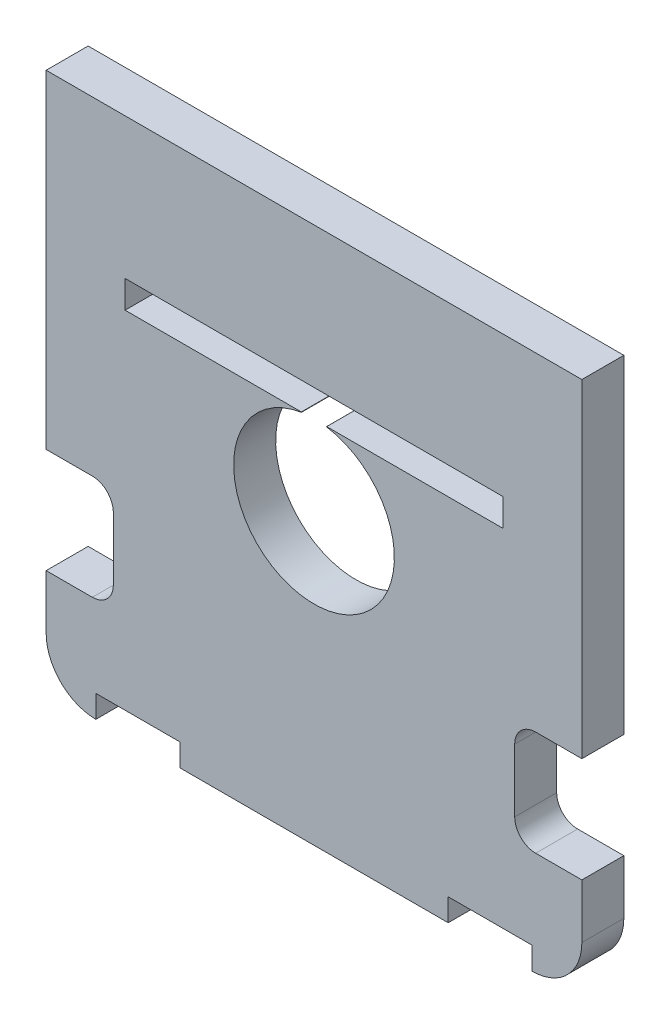
ISO-10303-21;
HEADER;
FILE_DESCRIPTION(('STEP AP214'),'2;1');
FILE_NAME('part.step','',(''),(''),'','','');
FILE_SCHEMA(('AUTOMOTIVE_DESIGN { 1 0 10303 214 1 1 1 1 }'));
ENDSEC;
DATA;
#1=APPLICATION_CONTEXT('core data for automotive mechanical design processes');
#2=APPLICATION_PROTOCOL_DEFINITION('international standard','automotive_design',2000,#1);
#3=PRODUCT_CONTEXT('',#1,'mechanical');
#4=PRODUCT('Part','Part','',(#3));
#5=PRODUCT_RELATED_PRODUCT_CATEGORY('part','',(#4));
#6=PRODUCT_DEFINITION_FORMATION('','',#4);
#7=PRODUCT_DEFINITION_CONTEXT('part definition',#1,'design');
#8=PRODUCT_DEFINITION('design','',#6,#7);
#9=PRODUCT_DEFINITION_SHAPE('','',#8);
#10=(LENGTH_UNIT() NAMED_UNIT(*) SI_UNIT(.MILLI.,.METRE.));
#11=(NAMED_UNIT(*) PLANE_ANGLE_UNIT() SI_UNIT($,.RADIAN.));
#12=(NAMED_UNIT(*) SI_UNIT($,.STERADIAN.) SOLID_ANGLE_UNIT());
#13=UNCERTAINTY_MEASURE_WITH_UNIT(LENGTH_MEASURE(1.E-05),#10,'distance_accuracy_value','');
#14=(GEOMETRIC_REPRESENTATION_CONTEXT(3) GLOBAL_UNCERTAINTY_ASSIGNED_CONTEXT((#13)) GLOBAL_UNIT_ASSIGNED_CONTEXT((#10,
#11,#12)) REPRESENTATION_CONTEXT('',''));
#15=CARTESIAN_POINT('',(0.,0.,0.));
#16=DIRECTION('',(0.,0.,1.));
#17=DIRECTION('',(1.,0.,0.));
#18=AXIS2_PLACEMENT_3D('',#15,#16,#17);
#19=CARTESIAN_POINT('',(8814.23882325293,3005.60430587339,6.35));
#20=DIRECTION('',(0.,0.,1.));
#21=DIRECTION('',(1.,0.,0.));
#22=AXIS2_PLACEMENT_3D('',#19,#20,#21);
#23=PLANE('',#22);
#24=DIRECTION('',(-1.,0.,0.));
#25=VECTOR('',#24,1.);
#26=CARTESIAN_POINT('',(8740.19782325293,3058.44597791145,6.35));
#27=LINE('',#26,#25);
#28=CARTESIAN_POINT('',(8821.22382325293,3058.44597791145,6.35));
#29=VERTEX_POINT('',#28);
#30=CARTESIAN_POINT('',(8740.19782325293,3058.44597791145,6.35));
#31=VERTEX_POINT('',#30);
#32=EDGE_CURVE('E311',#29,#31,#27,.T.);
#33=ORIENTED_EDGE('',*,*,#32,.T.);
#34=DIRECTION('',(0.,-1.,0.));
#35=VECTOR('',#34,1.);
#36=CARTESIAN_POINT('',(8740.19782325293,3008.77930587339,6.35));
#37=LINE('',#36,#35);
#38=CARTESIAN_POINT('',(8740.19782325293,3008.77930587339,6.35));
#39=VERTEX_POINT('',#38);
#40=EDGE_CURVE('E314',#31,#39,#37,.T.);
#41=ORIENTED_EDGE('',*,*,#40,.T.);
#42=DIRECTION('',(1.,0.,0.));
#43=VECTOR('',#42,1.);
#44=CARTESIAN_POINT('',(8740.19782325293,3008.77930587339,6.35));
#45=LINE('',#44,#43);
#46=CARTESIAN_POINT('',(8747.18282325293,3008.77930587339,6.35));
#47=VERTEX_POINT('',#46);
#48=EDGE_CURVE('E317',#39,#47,#45,.T.);
#49=ORIENTED_EDGE('',*,*,#48,.T.);
#50=CARTESIAN_POINT('',(8747.18282325293,3005.60430587339,6.35));
#51=DIRECTION('',(0.,0.,-1.));
#52=DIRECTION('',(1.,0.,0.));
#53=AXIS2_PLACEMENT_3D('',#50,#51,#52);
#54=CIRCLE('',#53,3.17500000000037);
#55=CARTESIAN_POINT('',(8750.35782325293,3005.60430587339,6.35));
#56=VERTEX_POINT('',#55);
#57=EDGE_CURVE('E319',#47,#56,#54,.T.);
#58=ORIENTED_EDGE('',*,*,#57,.T.);
#59=DIRECTION('',(0.,-1.,0.));
#60=VECTOR('',#59,1.);
#61=CARTESIAN_POINT('',(8750.35782325293,3005.60430587339,6.35));
#62=LINE('',#61,#60);
#63=CARTESIAN_POINT('',(8750.35782325293,2996.07930587339,6.35));
#64=VERTEX_POINT('',#63);
#65=EDGE_CURVE('E321',#56,#64,#62,.T.);
#66=ORIENTED_EDGE('',*,*,#65,.T.);
#67=CARTESIAN_POINT('',(8747.18282325293,2996.07930587339,6.35));
#68=DIRECTION('',(0.,0.,-1.));
#69=DIRECTION('',(1.,0.,0.));
#70=AXIS2_PLACEMENT_3D('',#67,#68,#69);
#71=CIRCLE('',#70,3.17500000000037);
#72=CARTESIAN_POINT('',(8747.18282325293,2992.90430587339,6.35));
#73=VERTEX_POINT('',#72);
#74=EDGE_CURVE('E323',#64,#73,#71,.T.);
#75=ORIENTED_EDGE('',*,*,#74,.T.);
#76=DIRECTION('',(-1.,0.,0.));
#77=VECTOR('',#76,1.);
#78=CARTESIAN_POINT('',(8740.19782325293,2992.90430587339,6.35));
#79=LINE('',#78,#77);
#80=CARTESIAN_POINT('',(8740.19782325293,2992.90430587339,6.35));
#81=VERTEX_POINT('',#80);
#82=EDGE_CURVE('E325',#73,#81,#79,.T.);
#83=ORIENTED_EDGE('',*,*,#82,.T.);
#84=DIRECTION('',(2.16517983398784E-13,-1.,0.));
#85=VECTOR('',#84,1.);
#86=CARTESIAN_POINT('',(8740.19782325293,2984.70010587339,6.35));
#87=LINE('',#86,#85);
#88=CARTESIAN_POINT('',(8740.19782325293,2984.70010587339,6.35));
#89=VERTEX_POINT('',#88);
#90=EDGE_CURVE('E327',#81,#89,#87,.T.);
#91=ORIENTED_EDGE('',*,*,#90,.T.);
#92=CARTESIAN_POINT('',(8747.71622325293,2984.70010587339,6.35));
#93=DIRECTION('',(0.,0.,1.));
#94=DIRECTION('',(1.,0.,0.));
#95=AXIS2_PLACEMENT_3D('',#92,#93,#94);
#96=CIRCLE('',#95,7.51839999999904);
#97=CARTESIAN_POINT('',(8747.71622325293,2977.18170587339,6.35));
#98=VERTEX_POINT('',#97);
#99=EDGE_CURVE('E329',#89,#98,#96,.T.);
#100=ORIENTED_EDGE('',*,*,#99,.T.);
#101=DIRECTION('',(0.,1.,0.));
#102=VECTOR('',#101,1.);
#103=CARTESIAN_POINT('',(8747.71622325293,2980.58530587339,6.35));
#104=LINE('',#103,#102);
#105=CARTESIAN_POINT('',(8747.71622325293,2980.58530587339,6.35));
#106=VERTEX_POINT('',#105);
#107=EDGE_CURVE('E331',#98,#106,#104,.T.);
#108=ORIENTED_EDGE('',*,*,#107,.T.);
#109=DIRECTION('',(1.,0.,0.));
#110=VECTOR('',#109,1.);
#111=CARTESIAN_POINT('',(8760.41622325293,2980.58530587339,6.35));
#112=LINE('',#111,#110);
#113=CARTESIAN_POINT('',(8760.41622325293,2980.58530587339,6.35));
#114=VERTEX_POINT('',#113);
#115=EDGE_CURVE('E333',#106,#114,#112,.T.);
#116=ORIENTED_EDGE('',*,*,#115,.T.);
#117=DIRECTION('',(-1.04381057668354E-12,-1.,0.));
#118=VECTOR('',#117,1.);
#119=CARTESIAN_POINT('',(8760.41622325293,2980.58530587339,6.35));
#120=LINE('',#119,#118);
#121=CARTESIAN_POINT('',(8760.41622325293,2977.18170587339,6.35));
#122=VERTEX_POINT('',#121);
#123=EDGE_CURVE('E335',#114,#122,#120,.T.);
#124=ORIENTED_EDGE('',*,*,#123,.T.);
#125=DIRECTION('',(1.,0.,0.));
#126=VECTOR('',#125,1.);
#127=CARTESIAN_POINT('',(8801.00542325293,2977.18170587339,6.35));
#128=LINE('',#127,#126);
#129=CARTESIAN_POINT('',(8801.00542325293,2977.18170587339,6.35));
#130=VERTEX_POINT('',#129);
#131=EDGE_CURVE('E337',#122,#130,#128,.T.);
#132=ORIENTED_EDGE('',*,*,#131,.T.);
#133=DIRECTION('',(0.,1.,0.));
#134=VECTOR('',#133,1.);
#135=CARTESIAN_POINT('',(8801.00542325293,2980.58530587339,6.35));
#136=LINE('',#135,#134);
#137=CARTESIAN_POINT('',(8801.00542325293,2980.58530587339,6.35));
#138=VERTEX_POINT('',#137);
#139=EDGE_CURVE('E339',#130,#138,#136,.T.);
#140=ORIENTED_EDGE('',*,*,#139,.T.);
#141=DIRECTION('',(1.,0.,0.));
#142=VECTOR('',#141,1.);
#143=CARTESIAN_POINT('',(8813.70542325293,2980.58530587339,6.35));
#144=LINE('',#143,#142);
#145=CARTESIAN_POINT('',(8813.70542325293,2980.58530587339,6.35));
#146=VERTEX_POINT('',#145);
#147=EDGE_CURVE('E341',#138,#146,#144,.T.);
#148=ORIENTED_EDGE('',*,*,#147,.T.);
#149=DIRECTION('',(0.,-1.,0.));
#150=VECTOR('',#149,1.);
#151=CARTESIAN_POINT('',(8813.70542325293,2980.58530587339,6.35));
#152=LINE('',#151,#150);
#153=CARTESIAN_POINT('',(8813.70542325293,2977.18170587339,6.35));
#154=VERTEX_POINT('',#153);
#155=EDGE_CURVE('E343',#146,#154,#152,.T.);
#156=ORIENTED_EDGE('',*,*,#155,.T.);
#157=CARTESIAN_POINT('',(8813.70542325293,2984.70010587339,6.35));
#158=DIRECTION('',(0.,0.,1.));
#159=DIRECTION('',(1.,0.,0.));
#160=AXIS2_PLACEMENT_3D('',#157,#158,#159);
#161=CIRCLE('',#160,7.51840000000015);
#162=CARTESIAN_POINT('',(8821.22382325293,2984.70010587339,6.35));
#163=VERTEX_POINT('',#162);
#164=EDGE_CURVE('E345',#154,#163,#161,.T.);
#165=ORIENTED_EDGE('',*,*,#164,.T.);
#166=DIRECTION('',(2.16517983398784E-13,1.,0.));
#167=VECTOR('',#166,1.);
#168=CARTESIAN_POINT('',(8821.22382325293,2992.90430587339,6.35));
#169=LINE('',#168,#167);
#170=CARTESIAN_POINT('',(8821.22382325293,2992.90430587339,6.35));
#171=VERTEX_POINT('',#170);
#172=EDGE_CURVE('E347',#163,#171,#169,.T.);
#173=ORIENTED_EDGE('',*,*,#172,.T.);
#174=DIRECTION('',(-1.,0.,0.));
#175=VECTOR('',#174,1.);
#176=CARTESIAN_POINT('',(8821.22382325293,2992.90430587339,6.35));
#177=LINE('',#176,#175);
#178=CARTESIAN_POINT('',(8814.23882325293,2992.90430587339,6.35));
#179=VERTEX_POINT('',#178);
#180=EDGE_CURVE('E349',#171,#179,#177,.T.);
#181=ORIENTED_EDGE('',*,*,#180,.T.);
#182=CARTESIAN_POINT('',(8814.23882325293,2996.07930587339,6.35));
#183=DIRECTION('',(0.,0.,-1.));
#184=DIRECTION('',(1.,0.,0.));
#185=AXIS2_PLACEMENT_3D('',#182,#183,#184);
#186=CIRCLE('',#185,3.17500000000037);
#187=CARTESIAN_POINT('',(8811.06382325293,2996.07930587339,6.35));
#188=VERTEX_POINT('',#187);
#189=EDGE_CURVE('E351',#179,#188,#186,.T.);
#190=ORIENTED_EDGE('',*,*,#189,.T.);
#191=DIRECTION('',(0.,1.,0.));
#192=VECTOR('',#191,1.);
#193=CARTESIAN_POINT('',(8811.06382325293,3005.60430587339,6.35));
#194=LINE('',#193,#192);
#195=CARTESIAN_POINT('',(8811.06382325293,3005.60430587339,6.35));
#196=VERTEX_POINT('',#195);
#197=EDGE_CURVE('E353',#188,#196,#194,.T.);
#198=ORIENTED_EDGE('',*,*,#197,.T.);
#199=CARTESIAN_POINT('',(8814.23882325293,3005.60430587339,6.35));
#200=DIRECTION('',(0.,0.,-1.));
#201=DIRECTION('',(1.,0.,0.));
#202=AXIS2_PLACEMENT_3D('',#199,#200,#201);
#203=CIRCLE('',#202,3.17500000000037);
#204=CARTESIAN_POINT('',(8814.23882325293,3008.77930587339,6.35));
#205=VERTEX_POINT('',#204);
#206=EDGE_CURVE('E355',#196,#205,#203,.T.);
#207=ORIENTED_EDGE('',*,*,#206,.T.);
#208=DIRECTION('',(1.,0.,0.));
#209=VECTOR('',#208,1.);
#210=CARTESIAN_POINT('',(8821.22382325293,3008.77930587339,6.35));
#211=LINE('',#210,#209);
#212=CARTESIAN_POINT('',(8821.22382325293,3008.77930587339,6.35));
#213=VERTEX_POINT('',#212);
#214=EDGE_CURVE('E357',#205,#213,#211,.T.);
#215=ORIENTED_EDGE('',*,*,#214,.T.);
#216=DIRECTION('',(0.,1.,0.));
#217=VECTOR('',#216,1.);
#218=CARTESIAN_POINT('',(8821.22382325293,3058.44597791145,6.35));
#219=LINE('',#218,#217);
#220=EDGE_CURVE('E359',#213,#29,#219,.T.);
#221=ORIENTED_EDGE('',*,*,#220,.T.);
#222=EDGE_LOOP('',(#33,#41,#49,#58,#66,#75,#83,#91,#100,#108,#116,#124,#132,#140,#148,#156,#165,
#173,#181,#190,#198,#207,#215,#221));
#223=FACE_BOUND('',#222,.T.);
#224=DIRECTION('',(0.,-1.,0.));
#225=VECTOR('',#224,1.);
#226=CARTESIAN_POINT('',(8752.13582325293,3032.98550587339,6.35));
#227=LINE('',#226,#225);
#228=CARTESIAN_POINT('',(8752.13582325293,3037.15110587339,6.35));
#229=VERTEX_POINT('',#228);
#230=CARTESIAN_POINT('',(8752.13582325293,3032.98550587339,6.35));
#231=VERTEX_POINT('',#230);
#232=EDGE_CURVE('E254',#229,#231,#227,.T.);
#233=ORIENTED_EDGE('',*,*,#232,.F.);
#234=DIRECTION('',(-1.,0.,0.));
#235=VECTOR('',#234,1.);
#236=CARTESIAN_POINT('',(8752.13582325293,3037.15110587339,6.35));
#237=LINE('',#236,#235);
#238=CARTESIAN_POINT('',(8809.28582325293,3037.15110587339,6.35));
#239=VERTEX_POINT('',#238);
#240=EDGE_CURVE('E246',#239,#229,#237,.T.);
#241=ORIENTED_EDGE('',*,*,#240,.F.);
#242=DIRECTION('',(4.26434808767026E-13,1.,0.));
#243=VECTOR('',#242,1.);
#244=CARTESIAN_POINT('',(8809.28582325293,3037.15110587339,6.35));
#245=LINE('',#244,#243);
#246=CARTESIAN_POINT('',(8809.28582325293,3032.98550587339,6.35));
#247=VERTEX_POINT('',#246);
#248=EDGE_CURVE('E279',#247,#239,#245,.T.);
#249=ORIENTED_EDGE('',*,*,#248,.F.);
#250=DIRECTION('',(1.,0.,0.));
#251=VECTOR('',#250,1.);
#252=CARTESIAN_POINT('',(8809.28582325293,3032.98550587339,6.35));
#253=LINE('',#252,#251);
#254=CARTESIAN_POINT('',(8782.63150669621,3032.98550587339,6.35));
#255=VERTEX_POINT('',#254);
#256=EDGE_CURVE('E277',#255,#247,#253,.T.);
#257=ORIENTED_EDGE('',*,*,#256,.F.);
#258=CARTESIAN_POINT('',(8782.63150669622,3032.96010587339,6.35));
#259=DIRECTION('',(0.,0.,-1.));
#260=DIRECTION('',(1.,0.,0.));
#261=AXIS2_PLACEMENT_3D('',#258,#259,#260);
#262=CIRCLE('',#261,0.025400000191103);
#263=CARTESIAN_POINT('',(8782.62750109985,3032.93502370428,6.35));
#264=VERTEX_POINT('',#263);
#265=EDGE_CURVE('E275',#264,#255,#262,.T.);
#266=ORIENTED_EDGE('',*,*,#265,.F.);
#267=CARTESIAN_POINT('',(8780.71082325293,3020.93320587339,6.35));
#268=DIRECTION('',(0.,0.,1.));
#269=DIRECTION('',(1.,0.,0.));
#270=AXIS2_PLACEMENT_3D('',#267,#268,#269);
#271=CIRCLE('',#270,12.1538999999998);
#272=CARTESIAN_POINT('',(8778.79414540604,3032.93502370409,6.35));
#273=VERTEX_POINT('',#272);
#274=EDGE_CURVE('E273',#273,#264,#271,.T.);
#275=ORIENTED_EDGE('',*,*,#274,.F.);
#276=CARTESIAN_POINT('',(8778.79013981207,3032.96010587339,6.35));
#277=DIRECTION('',(0.,0.,-1.));
#278=DIRECTION('',(1.,0.,0.));
#279=AXIS2_PLACEMENT_3D('',#276,#277,#278);
#280=CIRCLE('',#279,0.0254000000000682);
#281=CARTESIAN_POINT('',(8778.79013980965,3032.98550587339,6.35));
#282=VERTEX_POINT('',#281);
#283=EDGE_CURVE('E269',#282,#273,#280,.T.);
#284=ORIENTED_EDGE('',*,*,#283,.F.);
#285=DIRECTION('',(1.,0.,0.));
#286=VECTOR('',#285,1.);
#287=CARTESIAN_POINT('',(8778.79013980965,3032.98550587339,6.35));
#288=LINE('',#287,#286);
#289=EDGE_CURVE('E267',#231,#282,#288,.T.);
#290=ORIENTED_EDGE('',*,*,#289,.F.);
#291=EDGE_LOOP('',(#233,#241,#249,#257,#266,#275,#284,#290));
#292=FACE_BOUND('',#291,.T.);
#293=ADVANCED_FACE('F37',(#223,#292),#23,.T.);
#294=CARTESIAN_POINT('',(8814.23882325293,3005.60430587339,0.));
#295=DIRECTION('',(0.,0.,1.));
#296=DIRECTION('',(1.,0.,0.));
#297=AXIS2_PLACEMENT_3D('',#294,#295,#296);
#298=PLANE('',#297);
#299=DIRECTION('',(-1.,0.,0.));
#300=VECTOR('',#299,1.);
#301=CARTESIAN_POINT('',(8740.19782325293,3058.44597791145,0.));
#302=LINE('',#301,#300);
#303=CARTESIAN_POINT('',(8821.22382325293,3058.44597791145,0.));
#304=VERTEX_POINT('',#303);
#305=CARTESIAN_POINT('',(8740.19782325293,3058.44597791145,0.));
#306=VERTEX_POINT('',#305);
#307=EDGE_CURVE('E262',#304,#306,#302,.T.);
#308=ORIENTED_EDGE('',*,*,#307,.F.);
#309=DIRECTION('',(0.,1.,0.));
#310=VECTOR('',#309,1.);
#311=CARTESIAN_POINT('',(8821.22382325293,3058.44597791145,0.));
#312=LINE('',#311,#310);
#313=CARTESIAN_POINT('',(8821.22382325293,3008.77930587339,0.));
#314=VERTEX_POINT('',#313);
#315=EDGE_CURVE('E315',#314,#304,#312,.T.);
#316=ORIENTED_EDGE('',*,*,#315,.F.);
#317=DIRECTION('',(1.,0.,0.));
#318=VECTOR('',#317,1.);
#319=CARTESIAN_POINT('',(8821.22382325293,3008.77930587339,0.));
#320=LINE('',#319,#318);
#321=CARTESIAN_POINT('',(8814.23882325293,3008.77930587339,0.));
#322=VERTEX_POINT('',#321);
#323=EDGE_CURVE('E406',#322,#314,#320,.T.);
#324=ORIENTED_EDGE('',*,*,#323,.F.);
#325=CARTESIAN_POINT('',(8814.23882325293,3005.60430587339,0.));
#326=DIRECTION('',(0.,0.,-1.));
#327=DIRECTION('',(1.,0.,0.));
#328=AXIS2_PLACEMENT_3D('',#325,#326,#327);
#329=CIRCLE('',#328,3.17500000000037);
#330=CARTESIAN_POINT('',(8811.06382325293,3005.60430587339,0.));
#331=VERTEX_POINT('',#330);
#332=EDGE_CURVE('E404',#331,#322,#329,.T.);
#333=ORIENTED_EDGE('',*,*,#332,.F.);
#334=DIRECTION('',(0.,1.,0.));
#335=VECTOR('',#334,1.);
#336=CARTESIAN_POINT('',(8811.06382325293,3005.60430587339,0.));
#337=LINE('',#336,#335);
#338=CARTESIAN_POINT('',(8811.06382325293,2996.07930587339,0.));
#339=VERTEX_POINT('',#338);
#340=EDGE_CURVE('E402',#339,#331,#337,.T.);
#341=ORIENTED_EDGE('',*,*,#340,.F.);
#342=CARTESIAN_POINT('',(8814.23882325293,2996.07930587339,0.));
#343=DIRECTION('',(0.,0.,-1.));
#344=DIRECTION('',(1.,0.,0.));
#345=AXIS2_PLACEMENT_3D('',#342,#343,#344);
#346=CIRCLE('',#345,3.17500000000037);
#347=CARTESIAN_POINT('',(8814.23882325293,2992.90430587339,0.));
#348=VERTEX_POINT('',#347);
#349=EDGE_CURVE('E400',#348,#339,#346,.T.);
#350=ORIENTED_EDGE('',*,*,#349,.F.);
#351=DIRECTION('',(-1.,0.,0.));
#352=VECTOR('',#351,1.);
#353=CARTESIAN_POINT('',(8821.22382325293,2992.90430587339,0.));
#354=LINE('',#353,#352);
#355=CARTESIAN_POINT('',(8821.22382325293,2992.90430587339,0.));
#356=VERTEX_POINT('',#355);
#357=EDGE_CURVE('E398',#356,#348,#354,.T.);
#358=ORIENTED_EDGE('',*,*,#357,.F.);
#359=DIRECTION('',(2.16517983398784E-13,1.,0.));
#360=VECTOR('',#359,1.);
#361=CARTESIAN_POINT('',(8821.22382325293,2992.90430587339,0.));
#362=LINE('',#361,#360);
#363=CARTESIAN_POINT('',(8821.22382325293,2984.70010587339,0.));
#364=VERTEX_POINT('',#363);
#365=EDGE_CURVE('E396',#364,#356,#362,.T.);
#366=ORIENTED_EDGE('',*,*,#365,.F.);
#367=CARTESIAN_POINT('',(8813.70542325293,2984.70010587339,0.));
#368=DIRECTION('',(0.,0.,1.));
#369=DIRECTION('',(1.,0.,0.));
#370=AXIS2_PLACEMENT_3D('',#367,#368,#369);
#371=CIRCLE('',#370,7.51840000000015);
#372=CARTESIAN_POINT('',(8813.70542325293,2977.18170587339,0.));
#373=VERTEX_POINT('',#372);
#374=EDGE_CURVE('E394',#373,#364,#371,.T.);
#375=ORIENTED_EDGE('',*,*,#374,.F.);
#376=DIRECTION('',(0.,-1.,0.));
#377=VECTOR('',#376,1.);
#378=CARTESIAN_POINT('',(8813.70542325293,2980.58530587339,0.));
#379=LINE('',#378,#377);
#380=CARTESIAN_POINT('',(8813.70542325293,2980.58530587339,0.));
#381=VERTEX_POINT('',#380);
#382=EDGE_CURVE('E392',#381,#373,#379,.T.);
#383=ORIENTED_EDGE('',*,*,#382,.F.);
#384=DIRECTION('',(1.,0.,0.));
#385=VECTOR('',#384,1.);
#386=CARTESIAN_POINT('',(8813.70542325293,2980.58530587339,0.));
#387=LINE('',#386,#385);
#388=CARTESIAN_POINT('',(8801.00542325293,2980.58530587339,0.));
#389=VERTEX_POINT('',#388);
#390=EDGE_CURVE('E390',#389,#381,#387,.T.);
#391=ORIENTED_EDGE('',*,*,#390,.F.);
#392=DIRECTION('',(0.,1.,0.));
#393=VECTOR('',#392,1.);
#394=CARTESIAN_POINT('',(8801.00542325293,2980.58530587339,0.));
#395=LINE('',#394,#393);
#396=CARTESIAN_POINT('',(8801.00542325293,2977.18170587339,0.));
#397=VERTEX_POINT('',#396);
#398=EDGE_CURVE('E388',#397,#389,#395,.T.);
#399=ORIENTED_EDGE('',*,*,#398,.F.);
#400=DIRECTION('',(1.,0.,0.));
#401=VECTOR('',#400,1.);
#402=CARTESIAN_POINT('',(8801.00542325293,2977.18170587339,0.));
#403=LINE('',#402,#401);
#404=CARTESIAN_POINT('',(8760.41622325293,2977.18170587339,0.));
#405=VERTEX_POINT('',#404);
#406=EDGE_CURVE('E386',#405,#397,#403,.T.);
#407=ORIENTED_EDGE('',*,*,#406,.F.);
#408=DIRECTION('',(-1.04381057668354E-12,-1.,0.));
#409=VECTOR('',#408,1.);
#410=CARTESIAN_POINT('',(8760.41622325293,2980.58530587339,0.));
#411=LINE('',#410,#409);
#412=CARTESIAN_POINT('',(8760.41622325293,2980.58530587339,0.));
#413=VERTEX_POINT('',#412);
#414=EDGE_CURVE('E384',#413,#405,#411,.T.);
#415=ORIENTED_EDGE('',*,*,#414,.F.);
#416=DIRECTION('',(1.,0.,0.));
#417=VECTOR('',#416,1.);
#418=CARTESIAN_POINT('',(8760.41622325293,2980.58530587339,0.));
#419=LINE('',#418,#417);
#420=CARTESIAN_POINT('',(8747.71622325293,2980.58530587339,0.));
#421=VERTEX_POINT('',#420);
#422=EDGE_CURVE('E382',#421,#413,#419,.T.);
#423=ORIENTED_EDGE('',*,*,#422,.F.);
#424=DIRECTION('',(0.,1.,0.));
#425=VECTOR('',#424,1.);
#426=CARTESIAN_POINT('',(8747.71622325293,2980.58530587339,0.));
#427=LINE('',#426,#425);
#428=CARTESIAN_POINT('',(8747.71622325293,2977.18170587339,0.));
#429=VERTEX_POINT('',#428);
#430=EDGE_CURVE('E380',#429,#421,#427,.T.);
#431=ORIENTED_EDGE('',*,*,#430,.F.);
#432=CARTESIAN_POINT('',(8747.71622325293,2984.70010587339,0.));
#433=DIRECTION('',(0.,0.,1.));
#434=DIRECTION('',(1.,0.,0.));
#435=AXIS2_PLACEMENT_3D('',#432,#433,#434);
#436=CIRCLE('',#435,7.51839999999904);
#437=CARTESIAN_POINT('',(8740.19782325293,2984.70010587339,0.));
#438=VERTEX_POINT('',#437);
#439=EDGE_CURVE('E378',#438,#429,#436,.T.);
#440=ORIENTED_EDGE('',*,*,#439,.F.);
#441=DIRECTION('',(2.16517983398784E-13,-1.,0.));
#442=VECTOR('',#441,1.);
#443=CARTESIAN_POINT('',(8740.19782325293,2984.70010587339,0.));
#444=LINE('',#443,#442);
#445=CARTESIAN_POINT('',(8740.19782325293,2992.90430587339,0.));
#446=VERTEX_POINT('',#445);
#447=EDGE_CURVE('E376',#446,#438,#444,.T.);
#448=ORIENTED_EDGE('',*,*,#447,.F.);
#449=DIRECTION('',(-1.,0.,0.));
#450=VECTOR('',#449,1.);
#451=CARTESIAN_POINT('',(8740.19782325293,2992.90430587339,0.));
#452=LINE('',#451,#450);
#453=CARTESIAN_POINT('',(8747.18282325293,2992.90430587339,0.));
#454=VERTEX_POINT('',#453);
#455=EDGE_CURVE('E374',#454,#446,#452,.T.);
#456=ORIENTED_EDGE('',*,*,#455,.F.);
#457=CARTESIAN_POINT('',(8747.18282325293,2996.07930587339,0.));
#458=DIRECTION('',(0.,0.,-1.));
#459=DIRECTION('',(1.,0.,0.));
#460=AXIS2_PLACEMENT_3D('',#457,#458,#459);
#461=CIRCLE('',#460,3.17500000000037);
#462=CARTESIAN_POINT('',(8750.35782325293,2996.07930587339,0.));
#463=VERTEX_POINT('',#462);
#464=EDGE_CURVE('E372',#463,#454,#461,.T.);
#465=ORIENTED_EDGE('',*,*,#464,.F.);
#466=DIRECTION('',(0.,-1.,0.));
#467=VECTOR('',#466,1.);
#468=CARTESIAN_POINT('',(8750.35782325293,3005.60430587339,0.));
#469=LINE('',#468,#467);
#470=CARTESIAN_POINT('',(8750.35782325293,3005.60430587339,0.));
#471=VERTEX_POINT('',#470);
#472=EDGE_CURVE('E370',#471,#463,#469,.T.);
#473=ORIENTED_EDGE('',*,*,#472,.F.);
#474=CARTESIAN_POINT('',(8747.18282325293,3005.60430587339,0.));
#475=DIRECTION('',(0.,0.,-1.));
#476=DIRECTION('',(1.,0.,0.));
#477=AXIS2_PLACEMENT_3D('',#474,#475,#476);
#478=CIRCLE('',#477,3.17500000000037);
#479=CARTESIAN_POINT('',(8747.18282325293,3008.77930587339,0.));
#480=VERTEX_POINT('',#479);
#481=EDGE_CURVE('E368',#480,#471,#478,.T.);
#482=ORIENTED_EDGE('',*,*,#481,.F.);
#483=DIRECTION('',(1.,0.,0.));
#484=VECTOR('',#483,1.);
#485=CARTESIAN_POINT('',(8740.19782325293,3008.77930587339,0.));
#486=LINE('',#485,#484);
#487=CARTESIAN_POINT('',(8740.19782325293,3008.77930587339,0.));
#488=VERTEX_POINT('',#487);
#489=EDGE_CURVE('E366',#488,#480,#486,.T.);
#490=ORIENTED_EDGE('',*,*,#489,.F.);
#491=DIRECTION('',(0.,-1.,0.));
#492=VECTOR('',#491,1.);
#493=CARTESIAN_POINT('',(8740.19782325293,3008.77930587339,0.));
#494=LINE('',#493,#492);
#495=EDGE_CURVE('E364',#306,#488,#494,.T.);
#496=ORIENTED_EDGE('',*,*,#495,.F.);
#497=EDGE_LOOP('',(#308,#316,#324,#333,#341,#350,#358,#366,#375,#383,#391,#399,#407,#415,#423,
#431,#440,#448,#456,#465,#473,#482,#490,#496));
#498=FACE_BOUND('',#497,.T.);
#499=DIRECTION('',(-1.,0.,0.));
#500=VECTOR('',#499,1.);
#501=CARTESIAN_POINT('',(8752.13582325293,3037.15110587339,0.));
#502=LINE('',#501,#500);
#503=CARTESIAN_POINT('',(8809.28582325293,3037.15110587339,0.));
#504=VERTEX_POINT('',#503);
#505=CARTESIAN_POINT('',(8752.13582325293,3037.15110587339,0.));
#506=VERTEX_POINT('',#505);
#507=EDGE_CURVE('E60',#504,#506,#502,.T.);
#508=ORIENTED_EDGE('',*,*,#507,.T.);
#509=DIRECTION('',(0.,-1.,0.));
#510=VECTOR('',#509,1.);
#511=CARTESIAN_POINT('',(8752.13582325293,3032.98550587339,0.));
#512=LINE('',#511,#510);
#513=CARTESIAN_POINT('',(8752.13582325293,3032.98550587339,0.));
#514=VERTEX_POINT('',#513);
#515=EDGE_CURVE('E261',#506,#514,#512,.T.);
#516=ORIENTED_EDGE('',*,*,#515,.T.);
#517=DIRECTION('',(1.,0.,0.));
#518=VECTOR('',#517,1.);
#519=CARTESIAN_POINT('',(8778.79013980965,3032.98550587339,0.));
#520=LINE('',#519,#518);
#521=CARTESIAN_POINT('',(8778.79013980965,3032.98550587339,0.));
#522=VERTEX_POINT('',#521);
#523=EDGE_CURVE('E283',#514,#522,#520,.T.);
#524=ORIENTED_EDGE('',*,*,#523,.T.);
#525=CARTESIAN_POINT('',(8778.79013981207,3032.96010587339,0.));
#526=DIRECTION('',(0.,0.,-1.));
#527=DIRECTION('',(1.,0.,0.));
#528=AXIS2_PLACEMENT_3D('',#525,#526,#527);
#529=CIRCLE('',#528,0.0254000000000682);
#530=CARTESIAN_POINT('',(8778.79414540604,3032.93502370409,0.));
#531=VERTEX_POINT('',#530);
#532=EDGE_CURVE('E286',#522,#531,#529,.T.);
#533=ORIENTED_EDGE('',*,*,#532,.T.);
#534=CARTESIAN_POINT('',(8780.71082325293,3020.93320587339,0.));
#535=DIRECTION('',(0.,0.,1.));
#536=DIRECTION('',(1.,0.,0.));
#537=AXIS2_PLACEMENT_3D('',#534,#535,#536);
#538=CIRCLE('',#537,12.1538999999998);
#539=CARTESIAN_POINT('',(8782.62750109985,3032.93502370428,0.));
#540=VERTEX_POINT('',#539);
#541=EDGE_CURVE('E289',#531,#540,#538,.T.);
#542=ORIENTED_EDGE('',*,*,#541,.T.);
#543=CARTESIAN_POINT('',(8782.63150669622,3032.96010587339,0.));
#544=DIRECTION('',(0.,0.,-1.));
#545=DIRECTION('',(1.,0.,0.));
#546=AXIS2_PLACEMENT_3D('',#543,#544,#545);
#547=CIRCLE('',#546,0.025400000191103);
#548=CARTESIAN_POINT('',(8782.63150669621,3032.98550587339,0.));
#549=VERTEX_POINT('',#548);
#550=EDGE_CURVE('E292',#540,#549,#547,.T.);
#551=ORIENTED_EDGE('',*,*,#550,.T.);
#552=DIRECTION('',(1.,0.,0.));
#553=VECTOR('',#552,1.);
#554=CARTESIAN_POINT('',(8809.28582325293,3032.98550587339,0.));
#555=LINE('',#554,#553);
#556=CARTESIAN_POINT('',(8809.28582325293,3032.98550587339,0.));
#557=VERTEX_POINT('',#556);
#558=EDGE_CURVE('E295',#549,#557,#555,.T.);
#559=ORIENTED_EDGE('',*,*,#558,.T.);
#560=DIRECTION('',(4.26434808767026E-13,1.,0.));
#561=VECTOR('',#560,1.);
#562=CARTESIAN_POINT('',(8809.28582325293,3037.15110587339,0.));
#563=LINE('',#562,#561);
#564=EDGE_CURVE('E255',#557,#504,#563,.T.);
#565=ORIENTED_EDGE('',*,*,#564,.T.);
#566=EDGE_LOOP('',(#508,#516,#524,#533,#542,#551,#559,#565));
#567=FACE_BOUND('',#566,.T.);
#568=ADVANCED_FACE('F484',(#498,#567),#298,.F.);
#569=CARTESIAN_POINT('',(8740.19782325293,3058.44597791145,6.35));
#570=DIRECTION('',(0.,-1.,0.));
#571=DIRECTION('',(0.,0.,-1.));
#572=AXIS2_PLACEMENT_3D('',#569,#570,#571);
#573=PLANE('',#572);
#574=ORIENTED_EDGE('',*,*,#307,.T.);
#575=DIRECTION('',(0.,0.,-1.));
#576=VECTOR('',#575,1.);
#577=CARTESIAN_POINT('',(8740.19782325293,3058.44597791145,6.35));
#578=LINE('',#577,#576);
#579=EDGE_CURVE('E11',#31,#306,#578,.T.);
#580=ORIENTED_EDGE('',*,*,#579,.F.);
#581=ORIENTED_EDGE('',*,*,#32,.F.);
#582=DIRECTION('',(0.,0.,-1.));
#583=VECTOR('',#582,1.);
#584=CARTESIAN_POINT('',(8821.22382325293,3058.44597791145,6.35));
#585=LINE('',#584,#583);
#586=EDGE_CURVE('E361',#29,#304,#585,.T.);
#587=ORIENTED_EDGE('',*,*,#586,.T.);
#588=EDGE_LOOP('',(#574,#580,#581,#587));
#589=FACE_BOUND('',#588,.T.);
#590=ADVANCED_FACE('F39',(#589),#573,.F.);
#591=CARTESIAN_POINT('',(8740.19782325293,3008.77930587339,6.35));
#592=DIRECTION('',(1.,0.,0.));
#593=DIRECTION('',(0.,0.,-1.));
#594=AXIS2_PLACEMENT_3D('',#591,#592,#593);
#595=PLANE('',#594);
#596=ORIENTED_EDGE('',*,*,#495,.T.);
#597=DIRECTION('',(0.,0.,-1.));
#598=VECTOR('',#597,1.);
#599=CARTESIAN_POINT('',(8740.19782325293,3008.77930587339,6.35));
#600=LINE('',#599,#598);
#601=EDGE_CURVE('E45',#39,#488,#600,.T.);
#602=ORIENTED_EDGE('',*,*,#601,.F.);
#603=ORIENTED_EDGE('',*,*,#40,.F.);
#604=ORIENTED_EDGE('',*,*,#579,.T.);
#605=EDGE_LOOP('',(#596,#602,#603,#604));
#606=FACE_BOUND('',#605,.T.);
#607=ADVANCED_FACE('F501',(#606),#595,.F.);
#608=CARTESIAN_POINT('',(8740.19782325293,3008.77930587339,6.35));
#609=DIRECTION('',(0.,1.,0.));
#610=DIRECTION('',(0.,0.,1.));
#611=AXIS2_PLACEMENT_3D('',#608,#609,#610);
#612=PLANE('',#611);
#613=ORIENTED_EDGE('',*,*,#489,.T.);
#614=DIRECTION('',(0.,0.,-1.));
#615=VECTOR('',#614,1.);
#616=CARTESIAN_POINT('',(8747.18282325293,3008.77930587339,6.35));
#617=LINE('',#616,#615);
#618=EDGE_CURVE('E471',#47,#480,#617,.T.);
#619=ORIENTED_EDGE('',*,*,#618,.F.);
#620=ORIENTED_EDGE('',*,*,#48,.F.);
#621=ORIENTED_EDGE('',*,*,#601,.T.);
#622=EDGE_LOOP('',(#613,#619,#620,#621));
#623=FACE_BOUND('',#622,.T.);
#624=ADVANCED_FACE('F478',(#623),#612,.F.);
#625=CARTESIAN_POINT('',(8747.18282325293,3005.60430587339,6.35));
#626=DIRECTION('',(0.,0.,-1.));
#627=DIRECTION('',(-1.,0.,0.));
#628=AXIS2_PLACEMENT_3D('',#625,#626,#627);
#629=CYLINDRICAL_SURFACE('',#628,3.17500000000037);
#630=ORIENTED_EDGE('',*,*,#481,.T.);
#631=DIRECTION('',(0.,0.,-1.));
#632=VECTOR('',#631,1.);
#633=CARTESIAN_POINT('',(8750.35782325293,3005.60430587339,6.35));
#634=LINE('',#633,#632);
#635=EDGE_CURVE('E468',#56,#471,#634,.T.);
#636=ORIENTED_EDGE('',*,*,#635,.F.);
#637=ORIENTED_EDGE('',*,*,#57,.F.);
#638=ORIENTED_EDGE('',*,*,#618,.T.);
#639=EDGE_LOOP('',(#630,#636,#637,#638));
#640=FACE_BOUND('',#639,.T.);
#641=ADVANCED_FACE('F490',(#640),#629,.F.);
#642=CARTESIAN_POINT('',(8750.35782325293,3005.60430587339,6.35));
#643=DIRECTION('',(1.,0.,0.));
#644=DIRECTION('',(0.,0.,-1.));
#645=AXIS2_PLACEMENT_3D('',#642,#643,#644);
#646=PLANE('',#645);
#647=ORIENTED_EDGE('',*,*,#472,.T.);
#648=DIRECTION('',(0.,0.,-1.));
#649=VECTOR('',#648,1.);
#650=CARTESIAN_POINT('',(8750.35782325293,2996.07930587339,6.35));
#651=LINE('',#650,#649);
#652=EDGE_CURVE('E465',#64,#463,#651,.T.);
#653=ORIENTED_EDGE('',*,*,#652,.F.);
#654=ORIENTED_EDGE('',*,*,#65,.F.);
#655=ORIENTED_EDGE('',*,*,#635,.T.);
#656=EDGE_LOOP('',(#647,#653,#654,#655));
#657=FACE_BOUND('',#656,.T.);
#658=ADVANCED_FACE('F494',(#657),#646,.F.);
#659=CARTESIAN_POINT('',(8747.18282325293,2996.07930587339,6.35));
#660=DIRECTION('',(0.,0.,-1.));
#661=DIRECTION('',(-1.,0.,0.));
#662=AXIS2_PLACEMENT_3D('',#659,#660,#661);
#663=CYLINDRICAL_SURFACE('',#662,3.17500000000037);
#664=ORIENTED_EDGE('',*,*,#464,.T.);
#665=DIRECTION('',(0.,0.,-1.));
#666=VECTOR('',#665,1.);
#667=CARTESIAN_POINT('',(8747.18282325293,2992.90430587339,6.35));
#668=LINE('',#667,#666);
#669=EDGE_CURVE('E462',#73,#454,#668,.T.);
#670=ORIENTED_EDGE('',*,*,#669,.F.);
#671=ORIENTED_EDGE('',*,*,#74,.F.);
#672=ORIENTED_EDGE('',*,*,#652,.T.);
#673=EDGE_LOOP('',(#664,#670,#671,#672));
#674=FACE_BOUND('',#673,.T.);
#675=ADVANCED_FACE('F594',(#674),#663,.F.);
#676=CARTESIAN_POINT('',(8740.19782325293,2992.90430587339,6.35));
#677=DIRECTION('',(0.,-1.,0.));
#678=DIRECTION('',(0.,0.,-1.));
#679=AXIS2_PLACEMENT_3D('',#676,#677,#678);
#680=PLANE('',#679);
#681=ORIENTED_EDGE('',*,*,#455,.T.);
#682=DIRECTION('',(0.,0.,-1.));
#683=VECTOR('',#682,1.);
#684=CARTESIAN_POINT('',(8740.19782325293,2992.90430587339,6.35));
#685=LINE('',#684,#683);
#686=EDGE_CURVE('E459',#81,#446,#685,.T.);
#687=ORIENTED_EDGE('',*,*,#686,.F.);
#688=ORIENTED_EDGE('',*,*,#82,.F.);
#689=ORIENTED_EDGE('',*,*,#669,.T.);
#690=EDGE_LOOP('',(#681,#687,#688,#689));
#691=FACE_BOUND('',#690,.T.);
#692=ADVANCED_FACE('F592',(#691),#680,.F.);
#693=CARTESIAN_POINT('',(8740.19782325293,2984.70010587339,6.35));
#694=DIRECTION('',(1.,2.16517983398783E-13,0.));
#695=DIRECTION('',(-2.16517983398783E-13,1.,0.));
#696=AXIS2_PLACEMENT_3D('',#693,#694,#695);
#697=PLANE('',#696);
#698=ORIENTED_EDGE('',*,*,#447,.T.);
#699=DIRECTION('',(0.,0.,-1.));
#700=VECTOR('',#699,1.);
#701=CARTESIAN_POINT('',(8740.19782325293,2984.70010587339,6.35));
#702=LINE('',#701,#700);
#703=EDGE_CURVE('E456',#89,#438,#702,.T.);
#704=ORIENTED_EDGE('',*,*,#703,.F.);
#705=ORIENTED_EDGE('',*,*,#90,.F.);
#706=ORIENTED_EDGE('',*,*,#686,.T.);
#707=EDGE_LOOP('',(#698,#704,#705,#706));
#708=FACE_BOUND('',#707,.T.);
#709=ADVANCED_FACE('F588',(#708),#697,.F.);
#710=CARTESIAN_POINT('',(8747.71622325293,2984.70010587339,6.35));
#711=DIRECTION('',(0.,0.,-1.));
#712=DIRECTION('',(-1.,0.,0.));
#713=AXIS2_PLACEMENT_3D('',#710,#711,#712);
#714=CYLINDRICAL_SURFACE('',#713,7.51839999999904);
#715=ORIENTED_EDGE('',*,*,#439,.T.);
#716=DIRECTION('',(0.,0.,-1.));
#717=VECTOR('',#716,1.);
#718=CARTESIAN_POINT('',(8747.71622325293,2977.18170587339,6.35));
#719=LINE('',#718,#717);
#720=EDGE_CURVE('E453',#98,#429,#719,.T.);
#721=ORIENTED_EDGE('',*,*,#720,.F.);
#722=ORIENTED_EDGE('',*,*,#99,.F.);
#723=ORIENTED_EDGE('',*,*,#703,.T.);
#724=EDGE_LOOP('',(#715,#721,#722,#723));
#725=FACE_BOUND('',#724,.T.);
#726=ADVANCED_FACE('F583',(#725),#714,.T.);
#727=CARTESIAN_POINT('',(8747.71622325293,2980.58530587339,6.35));
#728=DIRECTION('',(-1.,0.,0.));
#729=DIRECTION('',(0.,0.,1.));
#730=AXIS2_PLACEMENT_3D('',#727,#728,#729);
#731=PLANE('',#730);
#732=ORIENTED_EDGE('',*,*,#430,.T.);
#733=DIRECTION('',(0.,0.,-1.));
#734=VECTOR('',#733,1.);
#735=CARTESIAN_POINT('',(8747.71622325293,2980.58530587339,6.35));
#736=LINE('',#735,#734);
#737=EDGE_CURVE('E450',#106,#421,#736,.T.);
#738=ORIENTED_EDGE('',*,*,#737,.F.);
#739=ORIENTED_EDGE('',*,*,#107,.F.);
#740=ORIENTED_EDGE('',*,*,#720,.T.);
#741=EDGE_LOOP('',(#732,#738,#739,#740));
#742=FACE_BOUND('',#741,.T.);
#743=ADVANCED_FACE('F577',(#742),#731,.F.);
#744=CARTESIAN_POINT('',(8760.41622325293,2980.58530587339,6.35));
#745=DIRECTION('',(0.,1.,0.));
#746=DIRECTION('',(0.,0.,1.));
#747=AXIS2_PLACEMENT_3D('',#744,#745,#746);
#748=PLANE('',#747);
#749=ORIENTED_EDGE('',*,*,#422,.T.);
#750=DIRECTION('',(0.,0.,-1.));
#751=VECTOR('',#750,1.);
#752=CARTESIAN_POINT('',(8760.41622325293,2980.58530587339,6.35));
#753=LINE('',#752,#751);
#754=EDGE_CURVE('E447',#114,#413,#753,.T.);
#755=ORIENTED_EDGE('',*,*,#754,.F.);
#756=ORIENTED_EDGE('',*,*,#115,.F.);
#757=ORIENTED_EDGE('',*,*,#737,.T.);
#758=EDGE_LOOP('',(#749,#755,#756,#757));
#759=FACE_BOUND('',#758,.T.);
#760=ADVANCED_FACE('F573',(#759),#748,.F.);
#761=CARTESIAN_POINT('',(8760.41622325293,2980.58530587339,6.35));
#762=DIRECTION('',(1.,-1.04381057668354E-12,0.));
#763=DIRECTION('',(1.04381057668354E-12,1.,0.));
#764=AXIS2_PLACEMENT_3D('',#761,#762,#763);
#765=PLANE('',#764);
#766=ORIENTED_EDGE('',*,*,#414,.T.);
#767=DIRECTION('',(0.,0.,-1.));
#768=VECTOR('',#767,1.);
#769=CARTESIAN_POINT('',(8760.41622325293,2977.18170587339,6.35));
#770=LINE('',#769,#768);
#771=EDGE_CURVE('E444',#122,#405,#770,.T.);
#772=ORIENTED_EDGE('',*,*,#771,.F.);
#773=ORIENTED_EDGE('',*,*,#123,.F.);
#774=ORIENTED_EDGE('',*,*,#754,.T.);
#775=EDGE_LOOP('',(#766,#772,#773,#774));
#776=FACE_BOUND('',#775,.T.);
#777=ADVANCED_FACE('F568',(#776),#765,.F.);
#778=CARTESIAN_POINT('',(8801.00542325293,2977.18170587339,6.35));
#779=DIRECTION('',(0.,1.,0.));
#780=DIRECTION('',(0.,0.,1.));
#781=AXIS2_PLACEMENT_3D('',#778,#779,#780);
#782=PLANE('',#781);
#783=ORIENTED_EDGE('',*,*,#406,.T.);
#784=DIRECTION('',(0.,0.,-1.));
#785=VECTOR('',#784,1.);
#786=CARTESIAN_POINT('',(8801.00542325293,2977.18170587339,6.35));
#787=LINE('',#786,#785);
#788=EDGE_CURVE('E441',#130,#397,#787,.T.);
#789=ORIENTED_EDGE('',*,*,#788,.F.);
#790=ORIENTED_EDGE('',*,*,#131,.F.);
#791=ORIENTED_EDGE('',*,*,#771,.T.);
#792=EDGE_LOOP('',(#783,#789,#790,#791));
#793=FACE_BOUND('',#792,.T.);
#794=ADVANCED_FACE('F562',(#793),#782,.F.);
#795=CARTESIAN_POINT('',(8801.00542325293,2980.58530587339,6.35));
#796=DIRECTION('',(-1.,0.,0.));
#797=DIRECTION('',(0.,0.,1.));
#798=AXIS2_PLACEMENT_3D('',#795,#796,#797);
#799=PLANE('',#798);
#800=ORIENTED_EDGE('',*,*,#398,.T.);
#801=DIRECTION('',(0.,0.,-1.));
#802=VECTOR('',#801,1.);
#803=CARTESIAN_POINT('',(8801.00542325293,2980.58530587339,6.35));
#804=LINE('',#803,#802);
#805=EDGE_CURVE('E438',#138,#389,#804,.T.);
#806=ORIENTED_EDGE('',*,*,#805,.F.);
#807=ORIENTED_EDGE('',*,*,#139,.F.);
#808=ORIENTED_EDGE('',*,*,#788,.T.);
#809=EDGE_LOOP('',(#800,#806,#807,#808));
#810=FACE_BOUND('',#809,.T.);
#811=ADVANCED_FACE('F558',(#810),#799,.F.);
#812=CARTESIAN_POINT('',(8813.70542325293,2980.58530587339,6.35));
#813=DIRECTION('',(0.,1.,0.));
#814=DIRECTION('',(0.,0.,1.));
#815=AXIS2_PLACEMENT_3D('',#812,#813,#814);
#816=PLANE('',#815);
#817=ORIENTED_EDGE('',*,*,#390,.T.);
#818=DIRECTION('',(0.,0.,-1.));
#819=VECTOR('',#818,1.);
#820=CARTESIAN_POINT('',(8813.70542325293,2980.58530587339,6.35));
#821=LINE('',#820,#819);
#822=EDGE_CURVE('E435',#146,#381,#821,.T.);
#823=ORIENTED_EDGE('',*,*,#822,.F.);
#824=ORIENTED_EDGE('',*,*,#147,.F.);
#825=ORIENTED_EDGE('',*,*,#805,.T.);
#826=EDGE_LOOP('',(#817,#823,#824,#825));
#827=FACE_BOUND('',#826,.T.);
#828=ADVANCED_FACE('F553',(#827),#816,.F.);
#829=CARTESIAN_POINT('',(8813.70542325293,2980.58530587339,6.35));
#830=DIRECTION('',(1.,0.,0.));
#831=DIRECTION('',(0.,0.,-1.));
#832=AXIS2_PLACEMENT_3D('',#829,#830,#831);
#833=PLANE('',#832);
#834=ORIENTED_EDGE('',*,*,#382,.T.);
#835=DIRECTION('',(0.,0.,-1.));
#836=VECTOR('',#835,1.);
#837=CARTESIAN_POINT('',(8813.70542325293,2977.18170587339,6.35));
#838=LINE('',#837,#836);
#839=EDGE_CURVE('E432',#154,#373,#838,.T.);
#840=ORIENTED_EDGE('',*,*,#839,.F.);
#841=ORIENTED_EDGE('',*,*,#155,.F.);
#842=ORIENTED_EDGE('',*,*,#822,.T.);
#843=EDGE_LOOP('',(#834,#840,#841,#842));
#844=FACE_BOUND('',#843,.T.);
#845=ADVANCED_FACE('F547',(#844),#833,.F.);
#846=CARTESIAN_POINT('',(8813.70542325293,2984.70010587339,6.35));
#847=DIRECTION('',(0.,0.,-1.));
#848=DIRECTION('',(-1.,0.,0.));
#849=AXIS2_PLACEMENT_3D('',#846,#847,#848);
#850=CYLINDRICAL_SURFACE('',#849,7.51840000000015);
#851=ORIENTED_EDGE('',*,*,#374,.T.);
#852=DIRECTION('',(0.,0.,-1.));
#853=VECTOR('',#852,1.);
#854=CARTESIAN_POINT('',(8821.22382325293,2984.70010587339,6.35));
#855=LINE('',#854,#853);
#856=EDGE_CURVE('E429',#163,#364,#855,.T.);
#857=ORIENTED_EDGE('',*,*,#856,.F.);
#858=ORIENTED_EDGE('',*,*,#164,.F.);
#859=ORIENTED_EDGE('',*,*,#839,.T.);
#860=EDGE_LOOP('',(#851,#857,#858,#859));
#861=FACE_BOUND('',#860,.T.);
#862=ADVANCED_FACE('F543',(#861),#850,.T.);
#863=CARTESIAN_POINT('',(8821.22382325293,2992.90430587339,6.35));
#864=DIRECTION('',(-1.,2.16517983398783E-13,0.));
#865=DIRECTION('',(-2.16517983398783E-13,-1.,0.));
#866=AXIS2_PLACEMENT_3D('',#863,#864,#865);
#867=PLANE('',#866);
#868=ORIENTED_EDGE('',*,*,#365,.T.);
#869=DIRECTION('',(0.,0.,-1.));
#870=VECTOR('',#869,1.);
#871=CARTESIAN_POINT('',(8821.22382325293,2992.90430587339,6.35));
#872=LINE('',#871,#870);
#873=EDGE_CURVE('E426',#171,#356,#872,.T.);
#874=ORIENTED_EDGE('',*,*,#873,.F.);
#875=ORIENTED_EDGE('',*,*,#172,.F.);
#876=ORIENTED_EDGE('',*,*,#856,.T.);
#877=EDGE_LOOP('',(#868,#874,#875,#876));
#878=FACE_BOUND('',#877,.T.);
#879=ADVANCED_FACE('F538',(#878),#867,.F.);
#880=CARTESIAN_POINT('',(8821.22382325293,2992.90430587339,6.35));
#881=DIRECTION('',(0.,-1.,0.));
#882=DIRECTION('',(0.,0.,-1.));
#883=AXIS2_PLACEMENT_3D('',#880,#881,#882);
#884=PLANE('',#883);
#885=ORIENTED_EDGE('',*,*,#357,.T.);
#886=DIRECTION('',(0.,0.,-1.));
#887=VECTOR('',#886,1.);
#888=CARTESIAN_POINT('',(8814.23882325293,2992.90430587339,6.35));
#889=LINE('',#888,#887);
#890=EDGE_CURVE('E423',#179,#348,#889,.T.);
#891=ORIENTED_EDGE('',*,*,#890,.F.);
#892=ORIENTED_EDGE('',*,*,#180,.F.);
#893=ORIENTED_EDGE('',*,*,#873,.T.);
#894=EDGE_LOOP('',(#885,#891,#892,#893));
#895=FACE_BOUND('',#894,.T.);
#896=ADVANCED_FACE('F532',(#895),#884,.F.);
#897=CARTESIAN_POINT('',(8814.23882325293,2996.07930587339,6.35));
#898=DIRECTION('',(0.,0.,-1.));
#899=DIRECTION('',(-1.,0.,0.));
#900=AXIS2_PLACEMENT_3D('',#897,#898,#899);
#901=CYLINDRICAL_SURFACE('',#900,3.17500000000037);
#902=ORIENTED_EDGE('',*,*,#349,.T.);
#903=DIRECTION('',(0.,0.,-1.));
#904=VECTOR('',#903,1.);
#905=CARTESIAN_POINT('',(8811.06382325293,2996.07930587339,6.35));
#906=LINE('',#905,#904);
#907=EDGE_CURVE('E420',#188,#339,#906,.T.);
#908=ORIENTED_EDGE('',*,*,#907,.F.);
#909=ORIENTED_EDGE('',*,*,#189,.F.);
#910=ORIENTED_EDGE('',*,*,#890,.T.);
#911=EDGE_LOOP('',(#902,#908,#909,#910));
#912=FACE_BOUND('',#911,.T.);
#913=ADVANCED_FACE('F528',(#912),#901,.F.);
#914=CARTESIAN_POINT('',(8811.06382325293,3005.60430587339,6.35));
#915=DIRECTION('',(-1.,0.,0.));
#916=DIRECTION('',(0.,0.,1.));
#917=AXIS2_PLACEMENT_3D('',#914,#915,#916);
#918=PLANE('',#917);
#919=ORIENTED_EDGE('',*,*,#340,.T.);
#920=DIRECTION('',(0.,0.,-1.));
#921=VECTOR('',#920,1.);
#922=CARTESIAN_POINT('',(8811.06382325293,3005.60430587339,6.35));
#923=LINE('',#922,#921);
#924=EDGE_CURVE('E417',#196,#331,#923,.T.);
#925=ORIENTED_EDGE('',*,*,#924,.F.);
#926=ORIENTED_EDGE('',*,*,#197,.F.);
#927=ORIENTED_EDGE('',*,*,#907,.T.);
#928=EDGE_LOOP('',(#919,#925,#926,#927));
#929=FACE_BOUND('',#928,.T.);
#930=ADVANCED_FACE('F523',(#929),#918,.F.);
#931=CARTESIAN_POINT('',(8814.23882325293,3005.60430587339,6.35));
#932=DIRECTION('',(0.,0.,-1.));
#933=DIRECTION('',(-1.,0.,0.));
#934=AXIS2_PLACEMENT_3D('',#931,#932,#933);
#935=CYLINDRICAL_SURFACE('',#934,3.17500000000037);
#936=ORIENTED_EDGE('',*,*,#332,.T.);
#937=DIRECTION('',(0.,0.,-1.));
#938=VECTOR('',#937,1.);
#939=CARTESIAN_POINT('',(8814.23882325293,3008.77930587339,6.35));
#940=LINE('',#939,#938);
#941=EDGE_CURVE('E414',#205,#322,#940,.T.);
#942=ORIENTED_EDGE('',*,*,#941,.F.);
#943=ORIENTED_EDGE('',*,*,#206,.F.);
#944=ORIENTED_EDGE('',*,*,#924,.T.);
#945=EDGE_LOOP('',(#936,#942,#943,#944));
#946=FACE_BOUND('',#945,.T.);
#947=ADVANCED_FACE('F517',(#946),#935,.F.);
#948=CARTESIAN_POINT('',(8821.22382325293,3008.77930587339,6.35));
#949=DIRECTION('',(0.,1.,0.));
#950=DIRECTION('',(0.,0.,1.));
#951=AXIS2_PLACEMENT_3D('',#948,#949,#950);
#952=PLANE('',#951);
#953=ORIENTED_EDGE('',*,*,#323,.T.);
#954=DIRECTION('',(0.,0.,-1.));
#955=VECTOR('',#954,1.);
#956=CARTESIAN_POINT('',(8821.22382325293,3008.77930587339,6.35));
#957=LINE('',#956,#955);
#958=EDGE_CURVE('E411',#213,#314,#957,.T.);
#959=ORIENTED_EDGE('',*,*,#958,.F.);
#960=ORIENTED_EDGE('',*,*,#214,.F.);
#961=ORIENTED_EDGE('',*,*,#941,.T.);
#962=EDGE_LOOP('',(#953,#959,#960,#961));
#963=FACE_BOUND('',#962,.T.);
#964=ADVANCED_FACE('F513',(#963),#952,.F.);
#965=CARTESIAN_POINT('',(8821.22382325293,3058.44597791145,6.35));
#966=DIRECTION('',(-1.,0.,0.));
#967=DIRECTION('',(0.,0.,1.));
#968=AXIS2_PLACEMENT_3D('',#965,#966,#967);
#969=PLANE('',#968);
#970=ORIENTED_EDGE('',*,*,#315,.T.);
#971=ORIENTED_EDGE('',*,*,#586,.F.);
#972=ORIENTED_EDGE('',*,*,#220,.F.);
#973=ORIENTED_EDGE('',*,*,#958,.T.);
#974=EDGE_LOOP('',(#970,#971,#972,#973));
#975=FACE_BOUND('',#974,.T.);
#976=ADVANCED_FACE('F508',(#975),#969,.F.);
#977=CARTESIAN_POINT('',(8752.13582325293,3037.15110587339,6.35));
#978=DIRECTION('',(0.,-1.,0.));
#979=DIRECTION('',(0.,0.,-1.));
#980=AXIS2_PLACEMENT_3D('',#977,#978,#979);
#981=PLANE('',#980);
#982=ORIENTED_EDGE('',*,*,#507,.F.);
#983=DIRECTION('',(0.,0.,-1.));
#984=VECTOR('',#983,1.);
#985=CARTESIAN_POINT('',(8809.28582325293,3037.15110587339,6.35));
#986=LINE('',#985,#984);
#987=EDGE_CURVE('E250',#239,#504,#986,.T.);
#988=ORIENTED_EDGE('',*,*,#987,.F.);
#989=ORIENTED_EDGE('',*,*,#240,.T.);
#990=DIRECTION('',(0.,0.,-1.));
#991=VECTOR('',#990,1.);
#992=CARTESIAN_POINT('',(8752.13582325293,3037.15110587339,6.35));
#993=LINE('',#992,#991);
#994=EDGE_CURVE('E249',#229,#506,#993,.T.);
#995=ORIENTED_EDGE('',*,*,#994,.T.);
#996=EDGE_LOOP('',(#982,#988,#989,#995));
#997=FACE_BOUND('',#996,.T.);
#998=ADVANCED_FACE('F248',(#997),#981,.T.);
#999=CARTESIAN_POINT('',(8752.13582325293,3032.98550587339,6.35));
#1000=DIRECTION('',(1.,0.,0.));
#1001=DIRECTION('',(0.,0.,-1.));
#1002=AXIS2_PLACEMENT_3D('',#999,#1000,#1001);
#1003=PLANE('',#1002);
#1004=ORIENTED_EDGE('',*,*,#515,.F.);
#1005=ORIENTED_EDGE('',*,*,#994,.F.);
#1006=ORIENTED_EDGE('',*,*,#232,.T.);
#1007=DIRECTION('',(0.,0.,-1.));
#1008=VECTOR('',#1007,1.);
#1009=CARTESIAN_POINT('',(8752.13582325293,3032.98550587339,6.35));
#1010=LINE('',#1009,#1008);
#1011=EDGE_CURVE('E263',#231,#514,#1010,.T.);
#1012=ORIENTED_EDGE('',*,*,#1011,.T.);
#1013=EDGE_LOOP('',(#1004,#1005,#1006,#1012));
#1014=FACE_BOUND('',#1013,.T.);
#1015=ADVANCED_FACE('F258',(#1014),#1003,.T.);
#1016=CARTESIAN_POINT('',(8778.79013980965,3032.98550587339,6.35));
#1017=DIRECTION('',(0.,1.,0.));
#1018=DIRECTION('',(-1.,0.,0.));
#1019=AXIS2_PLACEMENT_3D('',#1016,#1017,#1018);
#1020=PLANE('',#1019);
#1021=ORIENTED_EDGE('',*,*,#523,.F.);
#1022=ORIENTED_EDGE('',*,*,#1011,.F.);
#1023=ORIENTED_EDGE('',*,*,#289,.T.);
#1024=DIRECTION('',(0.,0.,-1.));
#1025=VECTOR('',#1024,1.);
#1026=CARTESIAN_POINT('',(8778.79013980965,3032.98550587339,6.35));
#1027=LINE('',#1026,#1025);
#1028=EDGE_CURVE('E308',#282,#522,#1027,.T.);
#1029=ORIENTED_EDGE('',*,*,#1028,.T.);
#1030=EDGE_LOOP('',(#1021,#1022,#1023,#1029));
#1031=FACE_BOUND('',#1030,.T.);
#1032=ADVANCED_FACE('F724',(#1031),#1020,.T.);
#1033=CARTESIAN_POINT('',(8778.79013981207,3032.96010587339,6.35));
#1034=DIRECTION('',(0.,0.,-1.));
#1035=DIRECTION('',(-1.,0.,0.));
#1036=AXIS2_PLACEMENT_3D('',#1033,#1034,#1035);
#1037=CYLINDRICAL_SURFACE('',#1036,0.0254000000000682);
#1038=ORIENTED_EDGE('',*,*,#532,.F.);
#1039=ORIENTED_EDGE('',*,*,#1028,.F.);
#1040=ORIENTED_EDGE('',*,*,#283,.T.);
#1041=DIRECTION('',(0.,0.,-1.));
#1042=VECTOR('',#1041,1.);
#1043=CARTESIAN_POINT('',(8778.79414540604,3032.93502370409,6.35));
#1044=LINE('',#1043,#1042);
#1045=EDGE_CURVE('E306',#273,#531,#1044,.T.);
#1046=ORIENTED_EDGE('',*,*,#1045,.T.);
#1047=EDGE_LOOP('',(#1038,#1039,#1040,#1046));
#1048=FACE_BOUND('',#1047,.T.);
#1049=ADVANCED_FACE('F730',(#1048),#1037,.T.);
#1050=CARTESIAN_POINT('',(8780.71082325293,3020.93320587339,6.35));
#1051=DIRECTION('',(0.,0.,-1.));
#1052=DIRECTION('',(-1.,0.,0.));
#1053=AXIS2_PLACEMENT_3D('',#1050,#1051,#1052);
#1054=CYLINDRICAL_SURFACE('',#1053,12.1538999999998);
#1055=ORIENTED_EDGE('',*,*,#541,.F.);
#1056=ORIENTED_EDGE('',*,*,#1045,.F.);
#1057=ORIENTED_EDGE('',*,*,#274,.T.);
#1058=DIRECTION('',(0.,0.,-1.));
#1059=VECTOR('',#1058,1.);
#1060=CARTESIAN_POINT('',(8782.62750109985,3032.93502370428,6.35));
#1061=LINE('',#1060,#1059);
#1062=EDGE_CURVE('E304',#264,#540,#1061,.T.);
#1063=ORIENTED_EDGE('',*,*,#1062,.T.);
#1064=EDGE_LOOP('',(#1055,#1056,#1057,#1063));
#1065=FACE_BOUND('',#1064,.T.);
#1066=ADVANCED_FACE('F738',(#1065),#1054,.F.);
#1067=CARTESIAN_POINT('',(8782.63150669622,3032.96010587339,6.35));
#1068=DIRECTION('',(0.,0.,-1.));
#1069=DIRECTION('',(-1.,0.,0.));
#1070=AXIS2_PLACEMENT_3D('',#1067,#1068,#1069);
#1071=CYLINDRICAL_SURFACE('',#1070,0.025400000191103);
#1072=ORIENTED_EDGE('',*,*,#550,.F.);
#1073=ORIENTED_EDGE('',*,*,#1062,.F.);
#1074=ORIENTED_EDGE('',*,*,#265,.T.);
#1075=DIRECTION('',(0.,0.,-1.));
#1076=VECTOR('',#1075,1.);
#1077=CARTESIAN_POINT('',(8782.63150669621,3032.98550587339,6.35));
#1078=LINE('',#1077,#1076);
#1079=EDGE_CURVE('E302',#255,#549,#1078,.T.);
#1080=ORIENTED_EDGE('',*,*,#1079,.T.);
#1081=EDGE_LOOP('',(#1072,#1073,#1074,#1080));
#1082=FACE_BOUND('',#1081,.T.);
#1083=ADVANCED_FACE('F746',(#1082),#1071,.T.);
#1084=CARTESIAN_POINT('',(8809.28582325293,3032.98550587339,6.35));
#1085=DIRECTION('',(0.,1.,0.));
#1086=DIRECTION('',(-1.,0.,0.));
#1087=AXIS2_PLACEMENT_3D('',#1084,#1085,#1086);
#1088=PLANE('',#1087);
#1089=ORIENTED_EDGE('',*,*,#558,.F.);
#1090=ORIENTED_EDGE('',*,*,#1079,.F.);
#1091=ORIENTED_EDGE('',*,*,#256,.T.);
#1092=DIRECTION('',(0.,0.,-1.));
#1093=VECTOR('',#1092,1.);
#1094=CARTESIAN_POINT('',(8809.28582325293,3032.98550587339,6.35));
#1095=LINE('',#1094,#1093);
#1096=EDGE_CURVE('E52',#247,#557,#1095,.T.);
#1097=ORIENTED_EDGE('',*,*,#1096,.T.);
#1098=EDGE_LOOP('',(#1089,#1090,#1091,#1097));
#1099=FACE_BOUND('',#1098,.T.);
#1100=ADVANCED_FACE('F754',(#1099),#1088,.T.);
#1101=CARTESIAN_POINT('',(8809.28582325293,3037.15110587339,6.35));
#1102=DIRECTION('',(-1.,4.26434808767026E-13,0.));
#1103=DIRECTION('',(-4.26434808767026E-13,-1.,0.));
#1104=AXIS2_PLACEMENT_3D('',#1101,#1102,#1103);
#1105=PLANE('',#1104);
#1106=ORIENTED_EDGE('',*,*,#564,.F.);
#1107=ORIENTED_EDGE('',*,*,#1096,.F.);
#1108=ORIENTED_EDGE('',*,*,#248,.T.);
#1109=ORIENTED_EDGE('',*,*,#987,.T.);
#1110=EDGE_LOOP('',(#1106,#1107,#1108,#1109));
#1111=FACE_BOUND('',#1110,.T.);
#1112=ADVANCED_FACE('F762',(#1111),#1105,.T.);
#1113=CLOSED_SHELL('',(#293,#568,#590,#607,#624,#641,#658,#675,#692,#709,#726,#743,#760,#777,
#794,#811,#828,#845,#862,#879,#896,#913,#930,#947,#964,#976,#998,#1015,#1032,#1049,#1066,#1083,
#1100,#1112));
#1114=MANIFOLD_SOLID_BREP('B2',#1113);
#1115=ADVANCED_BREP_SHAPE_REPRESENTATION('',(#18,#1114),#14);
#1116=SHAPE_DEFINITION_REPRESENTATION(#9,#1115);
ENDSEC;
END-ISO-10303-21;
